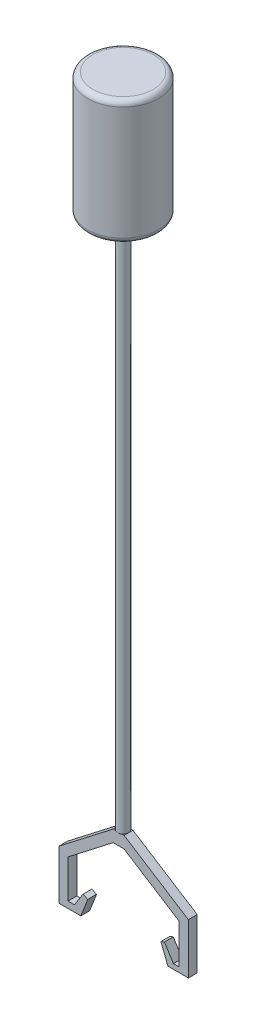
ISO-10303-21;
HEADER;
FILE_DESCRIPTION(('STEP AP214'),'2;1');
FILE_NAME('part.step','',(''),(''),'','','');
FILE_SCHEMA(('AUTOMOTIVE_DESIGN { 1 0 10303 214 1 1 1 1 }'));
ENDSEC;
DATA;
#1=APPLICATION_CONTEXT('core data for automotive mechanical design processes');
#2=APPLICATION_PROTOCOL_DEFINITION('international standard','automotive_design',2000,#1);
#3=PRODUCT_CONTEXT('',#1,'mechanical');
#4=PRODUCT('Part','Part','',(#3));
#5=PRODUCT_RELATED_PRODUCT_CATEGORY('part','',(#4));
#6=PRODUCT_DEFINITION_FORMATION('','',#4);
#7=PRODUCT_DEFINITION_CONTEXT('part definition',#1,'design');
#8=PRODUCT_DEFINITION('design','',#6,#7);
#9=PRODUCT_DEFINITION_SHAPE('','',#8);
#10=(LENGTH_UNIT() NAMED_UNIT(*) SI_UNIT(.MILLI.,.METRE.));
#11=(NAMED_UNIT(*) PLANE_ANGLE_UNIT() SI_UNIT($,.RADIAN.));
#12=(NAMED_UNIT(*) SI_UNIT($,.STERADIAN.) SOLID_ANGLE_UNIT());
#13=UNCERTAINTY_MEASURE_WITH_UNIT(LENGTH_MEASURE(1.E-05),#10,'distance_accuracy_value','');
#14=(GEOMETRIC_REPRESENTATION_CONTEXT(3) GLOBAL_UNCERTAINTY_ASSIGNED_CONTEXT((#13)) GLOBAL_UNIT_ASSIGNED_CONTEXT((#10,
#11,#12)) REPRESENTATION_CONTEXT('',''));
#15=CARTESIAN_POINT('',(0.,0.,0.));
#16=DIRECTION('',(0.,0.,1.));
#17=DIRECTION('',(1.,0.,0.));
#18=AXIS2_PLACEMENT_3D('',#15,#16,#17);
#19=CARTESIAN_POINT('',(0.,-1500.,0.));
#20=DIRECTION('',(0.,-1.,0.));
#21=DIRECTION('',(0.,0.,-1.));
#22=AXIS2_PLACEMENT_3D('',#19,#20,#21);
#23=PLANE('',#22);
#24=CARTESIAN_POINT('',(0.,-1500.,0.));
#25=DIRECTION('',(0.,-1.,0.));
#26=DIRECTION('',(0.,0.,-1.));
#27=AXIS2_PLACEMENT_3D('',#24,#25,#26);
#28=CIRCLE('',#27,15.3746627025601);
#29=CARTESIAN_POINT('',(-8.95155032480375,-1500.,-12.5));
#30=VERTEX_POINT('',#29);
#31=CARTESIAN_POINT('',(8.95155032480375,-1500.,-12.5));
#32=VERTEX_POINT('',#31);
#33=EDGE_CURVE('E214',#30,#32,#28,.T.);
#34=ORIENTED_EDGE('',*,*,#33,.T.);
#35=DIRECTION('',(-1.,0.,0.));
#36=VECTOR('',#35,1.);
#37=CARTESIAN_POINT('',(15.3746627025601,-1500.,-12.5));
#38=LINE('',#37,#36);
#39=EDGE_CURVE('E11',#32,#30,#38,.T.);
#40=ORIENTED_EDGE('',*,*,#39,.T.);
#41=EDGE_LOOP('',(#34,#40));
#42=FACE_BOUND('',#41,.T.);
#43=ADVANCED_FACE('F33',(#42),#23,.T.);
#44=CARTESIAN_POINT('',(0.,350.,0.));
#45=DIRECTION('',(0.,-1.,0.));
#46=DIRECTION('',(0.,0.,-1.));
#47=AXIS2_PLACEMENT_3D('',#44,#45,#46);
#48=CYLINDRICAL_SURFACE('',#47,100.);
#49=CARTESIAN_POINT('',(0.,15.,0.));
#50=DIRECTION('',(0.,1.,0.));
#51=DIRECTION('',(0.,0.,1.));
#52=AXIS2_PLACEMENT_3D('',#49,#50,#51);
#53=CIRCLE('',#52,100.);
#54=CARTESIAN_POINT('',(0.,15.,100.));
#55=VERTEX_POINT('',#54);
#56=EDGE_CURVE('E227',#55,#55,#53,.T.);
#57=ORIENTED_EDGE('',*,*,#56,.T.);
#58=EDGE_LOOP('',(#57));
#59=FACE_BOUND('',#58,.T.);
#60=CARTESIAN_POINT('',(0.,335.,0.));
#61=DIRECTION('',(0.,1.,0.));
#62=DIRECTION('',(0.,0.,1.));
#63=AXIS2_PLACEMENT_3D('',#60,#61,#62);
#64=CIRCLE('',#63,100.);
#65=CARTESIAN_POINT('',(0.,335.,100.));
#66=VERTEX_POINT('',#65);
#67=EDGE_CURVE('E223',#66,#66,#64,.F.);
#68=ORIENTED_EDGE('',*,*,#67,.T.);
#69=EDGE_LOOP('',(#68));
#70=FACE_BOUND('',#69,.T.);
#71=ADVANCED_FACE('F484',(#59,#70),#48,.T.);
#72=CARTESIAN_POINT('',(0.,350.,0.));
#73=DIRECTION('',(0.,1.,0.));
#74=DIRECTION('',(0.,0.,1.));
#75=AXIS2_PLACEMENT_3D('',#72,#73,#74);
#76=PLANE('',#75);
#77=CARTESIAN_POINT('',(0.,350.,0.));
#78=DIRECTION('',(0.,1.,0.));
#79=DIRECTION('',(0.,0.,1.));
#80=AXIS2_PLACEMENT_3D('',#77,#78,#79);
#81=CIRCLE('',#80,85.);
#82=CARTESIAN_POINT('',(0.,350.,85.));
#83=VERTEX_POINT('',#82);
#84=EDGE_CURVE('E232',#83,#83,#81,.T.);
#85=ORIENTED_EDGE('',*,*,#84,.T.);
#86=EDGE_LOOP('',(#85));
#87=FACE_BOUND('',#86,.T.);
#88=ADVANCED_FACE('F490',(#87),#76,.T.);
#89=CARTESIAN_POINT('',(0.,0.,0.));
#90=DIRECTION('',(0.,1.,0.));
#91=DIRECTION('',(0.,0.,1.));
#92=AXIS2_PLACEMENT_3D('',#89,#90,#91);
#93=PLANE('',#92);
#94=CARTESIAN_POINT('',(0.,0.,0.));
#95=DIRECTION('',(0.,1.,0.));
#96=DIRECTION('',(0.,0.,1.));
#97=AXIS2_PLACEMENT_3D('',#94,#95,#96);
#98=CIRCLE('',#97,15.3746627025601);
#99=CARTESIAN_POINT('',(0.,0.,15.3746627025601));
#100=VERTEX_POINT('',#99);
#101=EDGE_CURVE('E37',#100,#100,#98,.F.);
#102=ORIENTED_EDGE('',*,*,#101,.F.);
#103=EDGE_LOOP('',(#102));
#104=FACE_BOUND('',#103,.T.);
#105=CARTESIAN_POINT('',(0.,0.,0.));
#106=DIRECTION('',(0.,1.,0.));
#107=DIRECTION('',(0.,0.,1.));
#108=AXIS2_PLACEMENT_3D('',#105,#106,#107);
#109=CIRCLE('',#108,85.);
#110=CARTESIAN_POINT('',(0.,0.,85.));
#111=VERTEX_POINT('',#110);
#112=EDGE_CURVE('E230',#111,#111,#109,.F.);
#113=ORIENTED_EDGE('',*,*,#112,.T.);
#114=EDGE_LOOP('',(#113));
#115=FACE_BOUND('',#114,.T.);
#116=ADVANCED_FACE('F509',(#104,#115),#93,.F.);
#117=CARTESIAN_POINT('',(0.,15.,0.));
#118=DIRECTION('',(0.,1.,0.));
#119=DIRECTION('',(0.,0.,1.));
#120=AXIS2_PLACEMENT_3D('',#117,#118,#119);
#121=TOROIDAL_SURFACE('',#120,85.,15.);
#122=ORIENTED_EDGE('',*,*,#112,.F.);
#123=EDGE_LOOP('',(#122));
#124=FACE_BOUND('',#123,.T.);
#125=ORIENTED_EDGE('',*,*,#56,.F.);
#126=EDGE_LOOP('',(#125));
#127=FACE_BOUND('',#126,.T.);
#128=ADVANCED_FACE('F504',(#124,#127),#121,.T.);
#129=CARTESIAN_POINT('',(0.,335.,0.));
#130=DIRECTION('',(0.,1.,0.));
#131=DIRECTION('',(0.,0.,1.));
#132=AXIS2_PLACEMENT_3D('',#129,#130,#131);
#133=TOROIDAL_SURFACE('',#132,85.,15.);
#134=ORIENTED_EDGE('',*,*,#67,.F.);
#135=EDGE_LOOP('',(#134));
#136=FACE_BOUND('',#135,.T.);
#137=ORIENTED_EDGE('',*,*,#84,.F.);
#138=EDGE_LOOP('',(#137));
#139=FACE_BOUND('',#138,.T.);
#140=ADVANCED_FACE('F35',(#136,#139),#133,.T.);
#141=CARTESIAN_POINT('',(0.,-1500.,0.));
#142=DIRECTION('',(0.,1.,0.));
#143=DIRECTION('',(0.,0.,1.));
#144=AXIS2_PLACEMENT_3D('',#141,#142,#143);
#145=CYLINDRICAL_SURFACE('',#144,15.3746627025601);
#146=CARTESIAN_POINT('',(15.3746627025601,-1500.,0.));
#147=VERTEX_POINT('',#146);
#148=EDGE_CURVE('E218',#32,#147,#28,.T.);
#149=ORIENTED_EDGE('',*,*,#148,.F.);
#150=ORIENTED_EDGE('',*,*,#33,.F.);
#151=CARTESIAN_POINT('',(-15.3746627025601,-1500.,0.));
#152=VERTEX_POINT('',#151);
#153=EDGE_CURVE('E56',#152,#30,#28,.T.);
#154=ORIENTED_EDGE('',*,*,#153,.F.);
#155=CARTESIAN_POINT('',(-8.95155032480375,-1500.,12.5));
#156=VERTEX_POINT('',#155);
#157=EDGE_CURVE('E212',#156,#152,#28,.T.);
#158=ORIENTED_EDGE('',*,*,#157,.F.);
#159=CARTESIAN_POINT('',(8.95155032480375,-1500.,12.5));
#160=VERTEX_POINT('',#159);
#161=EDGE_CURVE('E250',#160,#156,#28,.T.);
#162=ORIENTED_EDGE('',*,*,#161,.F.);
#163=EDGE_CURVE('E224',#147,#160,#28,.T.);
#164=ORIENTED_EDGE('',*,*,#163,.F.);
#165=EDGE_LOOP('',(#149,#150,#154,#158,#162,#164));
#166=FACE_BOUND('',#165,.T.);
#167=ORIENTED_EDGE('',*,*,#101,.T.);
#168=EDGE_LOOP('',(#167));
#169=FACE_BOUND('',#168,.T.);
#170=ADVANCED_FACE('F496',(#166,#169),#145,.T.);
#171=DIRECTION('',(-1.,0.,0.));
#172=VECTOR('',#171,1.);
#173=CARTESIAN_POINT('',(15.3746627025601,-1500.,12.5));
#174=LINE('',#173,#172);
#175=EDGE_CURVE('E42',#160,#156,#174,.T.);
#176=ORIENTED_EDGE('',*,*,#175,.F.);
#177=ORIENTED_EDGE('',*,*,#161,.T.);
#178=EDGE_LOOP('',(#176,#177));
#179=FACE_BOUND('',#178,.T.);
#180=ADVANCED_FACE('F486',(#179),#23,.T.);
#181=CARTESIAN_POINT('',(15.3746627025601,-1500.,12.5));
#182=DIRECTION('',(0.,-1.,0.));
#183=DIRECTION('',(0.,0.,-1.));
#184=AXIS2_PLACEMENT_3D('',#181,#182,#183);
#185=PLANE('',#184);
#186=CARTESIAN_POINT('',(15.3746627025601,-1500.,-12.5));
#187=VERTEX_POINT('',#186);
#188=EDGE_CURVE('E44',#187,#32,#38,.T.);
#189=ORIENTED_EDGE('',*,*,#188,.T.);
#190=ORIENTED_EDGE('',*,*,#148,.T.);
#191=DIRECTION('',(0.,0.,-1.));
#192=VECTOR('',#191,1.);
#193=CARTESIAN_POINT('',(15.3746627025601,-1500.,12.5));
#194=LINE('',#193,#192);
#195=EDGE_CURVE('E308',#147,#187,#194,.T.);
#196=ORIENTED_EDGE('',*,*,#195,.T.);
#197=EDGE_LOOP('',(#189,#190,#196));
#198=FACE_BOUND('',#197,.T.);
#199=ADVANCED_FACE('F407',(#198),#185,.F.);
#200=CARTESIAN_POINT('',(15.3746627025601,-1500.,12.5));
#201=VERTEX_POINT('',#200);
#202=EDGE_CURVE('E247',#201,#147,#194,.T.);
#203=ORIENTED_EDGE('',*,*,#202,.T.);
#204=ORIENTED_EDGE('',*,*,#163,.T.);
#205=EDGE_CURVE('E199',#201,#160,#174,.T.);
#206=ORIENTED_EDGE('',*,*,#205,.F.);
#207=EDGE_LOOP('',(#203,#204,#206));
#208=FACE_BOUND('',#207,.T.);
#209=ADVANCED_FACE('F246',(#208),#185,.F.);
#210=CARTESIAN_POINT('',(-15.3746627025601,-1500.,12.5));
#211=VERTEX_POINT('',#210);
#212=EDGE_CURVE('E191',#156,#211,#174,.T.);
#213=ORIENTED_EDGE('',*,*,#212,.F.);
#214=ORIENTED_EDGE('',*,*,#157,.T.);
#215=DIRECTION('',(0.,0.,-1.));
#216=VECTOR('',#215,1.);
#217=CARTESIAN_POINT('',(-15.3746627025601,-1500.,12.5));
#218=LINE('',#217,#216);
#219=EDGE_CURVE('E205',#211,#152,#218,.T.);
#220=ORIENTED_EDGE('',*,*,#219,.F.);
#221=EDGE_LOOP('',(#213,#214,#220));
#222=FACE_BOUND('',#221,.T.);
#223=ADVANCED_FACE('F211',(#222),#185,.F.);
#224=CARTESIAN_POINT('',(-15.3746627025601,-1500.,-12.5));
#225=VERTEX_POINT('',#224);
#226=EDGE_CURVE('E215',#152,#225,#218,.T.);
#227=ORIENTED_EDGE('',*,*,#226,.F.);
#228=ORIENTED_EDGE('',*,*,#153,.T.);
#229=EDGE_CURVE('E45',#30,#225,#38,.T.);
#230=ORIENTED_EDGE('',*,*,#229,.T.);
#231=EDGE_LOOP('',(#227,#228,#230));
#232=FACE_BOUND('',#231,.T.);
#233=ADVANCED_FACE('F255',(#232),#185,.F.);
#234=CARTESIAN_POINT('',(-158.626316743505,-1610.66665151953,12.5));
#235=DIRECTION('',(0.611351309580811,-0.7913593218468,0.));
#236=DIRECTION('',(0.7913593218468,0.611351309580811,0.));
#237=AXIS2_PLACEMENT_3D('',#234,#235,#236);
#238=PLANE('',#237);
#239=DIRECTION('',(-0.7913593218468,-0.611351309580811,0.));
#240=VECTOR('',#239,1.);
#241=CARTESIAN_POINT('',(-158.626316743505,-1610.66665151953,-12.5));
#242=LINE('',#241,#240);
#243=CARTESIAN_POINT('',(-168.799765014435,-1618.52597755725,-12.5));
#244=VERTEX_POINT('',#243);
#245=EDGE_CURVE('E262',#225,#244,#242,.T.);
#246=ORIENTED_EDGE('',*,*,#245,.T.);
#247=DIRECTION('',(0.,0.,-1.));
#248=VECTOR('',#247,1.);
#249=CARTESIAN_POINT('',(-168.799765014435,-1618.52597755725,12.5));
#250=LINE('',#249,#248);
#251=CARTESIAN_POINT('',(-168.799765014435,-1618.52597755725,12.5));
#252=VERTEX_POINT('',#251);
#253=EDGE_CURVE('E207',#252,#244,#250,.T.);
#254=ORIENTED_EDGE('',*,*,#253,.F.);
#255=DIRECTION('',(-0.7913593218468,-0.611351309580811,0.));
#256=VECTOR('',#255,1.);
#257=CARTESIAN_POINT('',(-15.3746627025601,-1500.,12.5));
#258=LINE('',#257,#256);
#259=EDGE_CURVE('E195',#211,#252,#258,.T.);
#260=ORIENTED_EDGE('',*,*,#259,.F.);
#261=ORIENTED_EDGE('',*,*,#219,.T.);
#262=ORIENTED_EDGE('',*,*,#226,.T.);
#263=EDGE_LOOP('',(#246,#254,#260,#261,#262));
#264=FACE_BOUND('',#263,.T.);
#265=ADVANCED_FACE('F204',(#264),#238,.F.);
#266=CARTESIAN_POINT('',(-168.799765014435,-1618.52597755725,12.5));
#267=DIRECTION('',(1.,0.,0.));
#268=DIRECTION('',(0.,1.,0.));
#269=AXIS2_PLACEMENT_3D('',#266,#267,#268);
#270=PLANE('',#269);
#271=DIRECTION('',(0.,-1.,0.));
#272=VECTOR('',#271,1.);
#273=CARTESIAN_POINT('',(-168.799765014435,-1618.52597755725,-12.5));
#274=LINE('',#273,#272);
#275=CARTESIAN_POINT('',(-168.799765014435,-1757.60890789188,-12.5));
#276=VERTEX_POINT('',#275);
#277=EDGE_CURVE('E267',#244,#276,#274,.T.);
#278=ORIENTED_EDGE('',*,*,#277,.T.);
#279=DIRECTION('',(0.,0.,-1.));
#280=VECTOR('',#279,1.);
#281=CARTESIAN_POINT('',(-168.799765014435,-1757.60890789188,12.5));
#282=LINE('',#281,#280);
#283=CARTESIAN_POINT('',(-168.799765014435,-1757.60890789188,12.5));
#284=VERTEX_POINT('',#283);
#285=EDGE_CURVE('E355',#284,#276,#282,.T.);
#286=ORIENTED_EDGE('',*,*,#285,.F.);
#287=DIRECTION('',(0.,-1.,0.));
#288=VECTOR('',#287,1.);
#289=CARTESIAN_POINT('',(-168.799765014435,-1618.52597755725,12.5));
#290=LINE('',#289,#288);
#291=EDGE_CURVE('E209',#252,#284,#290,.T.);
#292=ORIENTED_EDGE('',*,*,#291,.F.);
#293=ORIENTED_EDGE('',*,*,#253,.T.);
#294=EDGE_LOOP('',(#278,#286,#292,#293));
#295=FACE_BOUND('',#294,.T.);
#296=ADVANCED_FACE('F361',(#295),#270,.F.);
#297=CARTESIAN_POINT('',(-142.539373210404,-1757.60890789188,12.5));
#298=DIRECTION('',(0.,1.,0.));
#299=DIRECTION('',(0.,0.,1.));
#300=AXIS2_PLACEMENT_3D('',#297,#298,#299);
#301=PLANE('',#300);
#302=DIRECTION('',(1.,0.,0.));
#303=VECTOR('',#302,1.);
#304=CARTESIAN_POINT('',(-142.539373210404,-1757.60890789188,-12.5));
#305=LINE('',#304,#303);
#306=CARTESIAN_POINT('',(-106.609537560218,-1757.60890789188,-12.5));
#307=VERTEX_POINT('',#306);
#308=EDGE_CURVE('E270',#276,#307,#305,.T.);
#309=ORIENTED_EDGE('',*,*,#308,.T.);
#310=DIRECTION('',(0.,0.,-1.));
#311=VECTOR('',#310,1.);
#312=CARTESIAN_POINT('',(-106.609537560218,-1757.60890789188,12.5));
#313=LINE('',#312,#311);
#314=CARTESIAN_POINT('',(-106.609537560218,-1757.60890789188,12.5));
#315=VERTEX_POINT('',#314);
#316=EDGE_CURVE('E353',#315,#307,#313,.T.);
#317=ORIENTED_EDGE('',*,*,#316,.F.);
#318=DIRECTION('',(1.,0.,0.));
#319=VECTOR('',#318,1.);
#320=CARTESIAN_POINT('',(-168.799765014435,-1757.60890789188,12.5));
#321=LINE('',#320,#319);
#322=EDGE_CURVE('E373',#284,#315,#321,.T.);
#323=ORIENTED_EDGE('',*,*,#322,.F.);
#324=ORIENTED_EDGE('',*,*,#285,.T.);
#325=EDGE_LOOP('',(#309,#317,#323,#324));
#326=FACE_BOUND('',#325,.T.);
#327=ADVANCED_FACE('F365',(#326),#301,.F.);
#328=CARTESIAN_POINT('',(-106.609537560218,-1757.60890789188,12.5));
#329=DIRECTION('',(-0.9316577784868,0.363337011306363,0.));
#330=DIRECTION('',(-0.363337011306363,-0.9316577784868,0.));
#331=AXIS2_PLACEMENT_3D('',#328,#329,#330);
#332=PLANE('',#331);
#333=DIRECTION('',(0.363337011306363,0.9316577784868,0.));
#334=VECTOR('',#333,1.);
#335=CARTESIAN_POINT('',(-106.609537560218,-1757.60890789188,-12.5));
#336=LINE('',#335,#334);
#337=CARTESIAN_POINT('',(-87.0004897230324,-1707.32798032948,-12.5));
#338=VERTEX_POINT('',#337);
#339=EDGE_CURVE('E272',#307,#338,#336,.T.);
#340=ORIENTED_EDGE('',*,*,#339,.T.);
#341=DIRECTION('',(0.,0.,-1.));
#342=VECTOR('',#341,1.);
#343=CARTESIAN_POINT('',(-87.0004897230324,-1707.32798032948,12.5));
#344=LINE('',#343,#342);
#345=CARTESIAN_POINT('',(-87.0004897230324,-1707.32798032948,12.5));
#346=VERTEX_POINT('',#345);
#347=EDGE_CURVE('E350',#346,#338,#344,.T.);
#348=ORIENTED_EDGE('',*,*,#347,.F.);
#349=DIRECTION('',(0.363337011306363,0.9316577784868,0.));
#350=VECTOR('',#349,1.);
#351=CARTESIAN_POINT('',(-106.609537560218,-1757.60890789188,12.5));
#352=LINE('',#351,#350);
#353=EDGE_CURVE('E370',#315,#346,#352,.T.);
#354=ORIENTED_EDGE('',*,*,#353,.F.);
#355=ORIENTED_EDGE('',*,*,#316,.T.);
#356=EDGE_LOOP('',(#340,#348,#354,#355));
#357=FACE_BOUND('',#356,.T.);
#358=ADVANCED_FACE('F368',(#357),#332,.F.);
#359=CARTESIAN_POINT('',(-87.0004897230324,-1707.32798032948,12.5));
#360=DIRECTION('',(-0.363337011306362,-0.931657778486801,0.));
#361=DIRECTION('',(0.931657778486801,-0.363337011306362,0.));
#362=AXIS2_PLACEMENT_3D('',#359,#360,#361);
#363=PLANE('',#362);
#364=DIRECTION('',(-0.931657778486801,0.363337011306361,0.));
#365=VECTOR('',#364,1.);
#366=CARTESIAN_POINT('',(-87.0004897230324,-1707.32798032948,-12.5));
#367=LINE('',#366,#365);
#368=CARTESIAN_POINT('',(-100.774753953756,-1701.95615806373,-12.5));
#369=VERTEX_POINT('',#368);
#370=EDGE_CURVE('E274',#338,#369,#367,.T.);
#371=ORIENTED_EDGE('',*,*,#370,.T.);
#372=DIRECTION('',(0.,0.,-1.));
#373=VECTOR('',#372,1.);
#374=CARTESIAN_POINT('',(-100.774753953756,-1701.95615806373,12.5));
#375=LINE('',#374,#373);
#376=CARTESIAN_POINT('',(-100.774753953756,-1701.95615806373,12.5));
#377=VERTEX_POINT('',#376);
#378=EDGE_CURVE('E347',#377,#369,#375,.T.);
#379=ORIENTED_EDGE('',*,*,#378,.F.);
#380=DIRECTION('',(-0.931657778486801,0.363337011306361,0.));
#381=VECTOR('',#380,1.);
#382=CARTESIAN_POINT('',(-87.0004897230324,-1707.32798032948,12.5));
#383=LINE('',#382,#381);
#384=EDGE_CURVE('E372',#346,#377,#383,.T.);
#385=ORIENTED_EDGE('',*,*,#384,.F.);
#386=ORIENTED_EDGE('',*,*,#347,.T.);
#387=EDGE_LOOP('',(#371,#379,#385,#386));
#388=FACE_BOUND('',#387,.T.);
#389=ADVANCED_FACE('F472',(#388),#363,.F.);
#390=CARTESIAN_POINT('',(-120.173982412122,-1732.46844411068,12.5));
#391=DIRECTION('',(0.843882904978558,-0.536527392296936,0.));
#392=DIRECTION('',(0.536527392296936,0.843882904978558,0.));
#393=AXIS2_PLACEMENT_3D('',#390,#391,#392);
#394=PLANE('',#393);
#395=DIRECTION('',(-0.536527392296936,-0.843882904978558,0.));
#396=VECTOR('',#395,1.);
#397=CARTESIAN_POINT('',(-120.173982412122,-1732.46844411068,-12.5));
#398=LINE('',#397,#396);
#399=CARTESIAN_POINT('',(-124.574455385311,-1739.38977556404,-12.5));
#400=VERTEX_POINT('',#399);
#401=EDGE_CURVE('E277',#369,#400,#398,.T.);
#402=ORIENTED_EDGE('',*,*,#401,.T.);
#403=DIRECTION('',(0.,0.,-1.));
#404=VECTOR('',#403,1.);
#405=CARTESIAN_POINT('',(-124.574455385311,-1739.38977556404,12.5));
#406=LINE('',#405,#404);
#407=CARTESIAN_POINT('',(-124.574455385311,-1739.38977556404,12.5));
#408=VERTEX_POINT('',#407);
#409=EDGE_CURVE('E344',#408,#400,#406,.T.);
#410=ORIENTED_EDGE('',*,*,#409,.F.);
#411=DIRECTION('',(-0.536527392296936,-0.843882904978558,0.));
#412=VECTOR('',#411,1.);
#413=CARTESIAN_POINT('',(-100.774753953756,-1701.95615806373,12.5));
#414=LINE('',#413,#412);
#415=EDGE_CURVE('E375',#377,#408,#414,.T.);
#416=ORIENTED_EDGE('',*,*,#415,.F.);
#417=ORIENTED_EDGE('',*,*,#378,.T.);
#418=EDGE_LOOP('',(#402,#410,#416,#417));
#419=FACE_BOUND('',#418,.T.);
#420=ADVANCED_FACE('F474',(#419),#394,.F.);
#421=CARTESIAN_POINT('',(-124.574455385311,-1739.38977556404,12.5));
#422=DIRECTION('',(0.,-1.,0.));
#423=DIRECTION('',(0.,0.,-1.));
#424=AXIS2_PLACEMENT_3D('',#421,#422,#423);
#425=PLANE('',#424);
#426=DIRECTION('',(-1.,0.,0.));
#427=VECTOR('',#426,1.);
#428=CARTESIAN_POINT('',(-124.574455385311,-1739.38977556404,-12.5));
#429=LINE('',#428,#427);
#430=CARTESIAN_POINT('',(-142.539373210404,-1739.38977556404,-12.5));
#431=VERTEX_POINT('',#430);
#432=EDGE_CURVE('E279',#400,#431,#429,.T.);
#433=ORIENTED_EDGE('',*,*,#432,.T.);
#434=DIRECTION('',(0.,0.,-1.));
#435=VECTOR('',#434,1.);
#436=CARTESIAN_POINT('',(-142.539373210404,-1739.38977556404,12.5));
#437=LINE('',#436,#435);
#438=CARTESIAN_POINT('',(-142.539373210404,-1739.38977556404,12.5));
#439=VERTEX_POINT('',#438);
#440=EDGE_CURVE('E341',#439,#431,#437,.T.);
#441=ORIENTED_EDGE('',*,*,#440,.F.);
#442=DIRECTION('',(-1.,0.,0.));
#443=VECTOR('',#442,1.);
#444=CARTESIAN_POINT('',(-124.574455385311,-1739.38977556404,12.5));
#445=LINE('',#444,#443);
#446=EDGE_CURVE('E381',#408,#439,#445,.T.);
#447=ORIENTED_EDGE('',*,*,#446,.F.);
#448=ORIENTED_EDGE('',*,*,#409,.T.);
#449=EDGE_LOOP('',(#433,#441,#447,#448));
#450=FACE_BOUND('',#449,.T.);
#451=ADVANCED_FACE('F467',(#450),#425,.F.);
#452=CARTESIAN_POINT('',(-142.539373210404,-1631.49028029963,12.5));
#453=DIRECTION('',(-1.,0.,0.));
#454=DIRECTION('',(0.,0.,1.));
#455=AXIS2_PLACEMENT_3D('',#452,#453,#454);
#456=PLANE('',#455);
#457=DIRECTION('',(0.,1.,0.));
#458=VECTOR('',#457,1.);
#459=CARTESIAN_POINT('',(-142.539373210404,-1631.49028029963,-12.5));
#460=LINE('',#459,#458);
#461=CARTESIAN_POINT('',(-142.539373210404,-1631.49028029963,-12.5));
#462=VERTEX_POINT('',#461);
#463=EDGE_CURVE('E281',#431,#462,#460,.T.);
#464=ORIENTED_EDGE('',*,*,#463,.T.);
#465=DIRECTION('',(0.,0.,-1.));
#466=VECTOR('',#465,1.);
#467=CARTESIAN_POINT('',(-142.539373210404,-1631.49028029963,12.5));
#468=LINE('',#467,#466);
#469=CARTESIAN_POINT('',(-142.539373210404,-1631.49028029963,12.5));
#470=VERTEX_POINT('',#469);
#471=EDGE_CURVE('E338',#470,#462,#468,.T.);
#472=ORIENTED_EDGE('',*,*,#471,.F.);
#473=DIRECTION('',(0.,1.,0.));
#474=VECTOR('',#473,1.);
#475=CARTESIAN_POINT('',(-142.539373210404,-1631.49028029963,12.5));
#476=LINE('',#475,#474);
#477=EDGE_CURVE('E383',#439,#470,#476,.T.);
#478=ORIENTED_EDGE('',*,*,#477,.F.);
#479=ORIENTED_EDGE('',*,*,#440,.T.);
#480=EDGE_LOOP('',(#464,#472,#478,#479));
#481=FACE_BOUND('',#480,.T.);
#482=ADVANCED_FACE('F463',(#481),#456,.F.);
#483=CARTESIAN_POINT('',(-15.3746627025601,-1533.25132593942,12.5));
#484=DIRECTION('',(-0.611351309580811,0.7913593218468,0.));
#485=DIRECTION('',(-0.7913593218468,-0.611351309580811,0.));
#486=AXIS2_PLACEMENT_3D('',#483,#484,#485);
#487=PLANE('',#486);
#488=DIRECTION('',(0.7913593218468,0.611351309580811,0.));
#489=VECTOR('',#488,1.);
#490=CARTESIAN_POINT('',(-15.3746627025601,-1533.25132593942,-12.5));
#491=LINE('',#490,#489);
#492=CARTESIAN_POINT('',(-15.3746627025601,-1533.25132593942,-12.5));
#493=VERTEX_POINT('',#492);
#494=EDGE_CURVE('E283',#462,#493,#491,.T.);
#495=ORIENTED_EDGE('',*,*,#494,.T.);
#496=DIRECTION('',(0.,0.,-1.));
#497=VECTOR('',#496,1.);
#498=CARTESIAN_POINT('',(-15.3746627025601,-1533.25132593942,12.5));
#499=LINE('',#498,#497);
#500=CARTESIAN_POINT('',(-15.3746627025601,-1533.25132593942,12.5));
#501=VERTEX_POINT('',#500);
#502=EDGE_CURVE('E335',#501,#493,#499,.T.);
#503=ORIENTED_EDGE('',*,*,#502,.F.);
#504=DIRECTION('',(0.7913593218468,0.611351309580811,0.));
#505=VECTOR('',#504,1.);
#506=CARTESIAN_POINT('',(-15.3746627025601,-1533.25132593942,12.5));
#507=LINE('',#506,#505);
#508=EDGE_CURVE('E385',#470,#501,#507,.T.);
#509=ORIENTED_EDGE('',*,*,#508,.F.);
#510=ORIENTED_EDGE('',*,*,#471,.T.);
#511=EDGE_LOOP('',(#495,#503,#509,#510));
#512=FACE_BOUND('',#511,.T.);
#513=ADVANCED_FACE('F458',(#512),#487,.F.);
#514=CARTESIAN_POINT('',(15.3746627025602,-1533.25132593942,12.5));
#515=DIRECTION('',(0.,1.,0.));
#516=DIRECTION('',(0.,0.,1.));
#517=AXIS2_PLACEMENT_3D('',#514,#515,#516);
#518=PLANE('',#517);
#519=DIRECTION('',(1.,0.,0.));
#520=VECTOR('',#519,1.);
#521=CARTESIAN_POINT('',(15.3746627025602,-1533.25132593942,-12.5));
#522=LINE('',#521,#520);
#523=CARTESIAN_POINT('',(15.3746627025602,-1533.25132593942,-12.5));
#524=VERTEX_POINT('',#523);
#525=EDGE_CURVE('E285',#493,#524,#522,.T.);
#526=ORIENTED_EDGE('',*,*,#525,.T.);
#527=DIRECTION('',(0.,0.,-1.));
#528=VECTOR('',#527,1.);
#529=CARTESIAN_POINT('',(15.3746627025602,-1533.25132593942,12.5));
#530=LINE('',#529,#528);
#531=CARTESIAN_POINT('',(15.3746627025602,-1533.25132593942,12.5));
#532=VERTEX_POINT('',#531);
#533=EDGE_CURVE('E332',#532,#524,#530,.T.);
#534=ORIENTED_EDGE('',*,*,#533,.F.);
#535=DIRECTION('',(1.,0.,0.));
#536=VECTOR('',#535,1.);
#537=CARTESIAN_POINT('',(15.3746627025602,-1533.25132593942,12.5));
#538=LINE('',#537,#536);
#539=EDGE_CURVE('E387',#501,#532,#538,.T.);
#540=ORIENTED_EDGE('',*,*,#539,.F.);
#541=ORIENTED_EDGE('',*,*,#502,.T.);
#542=EDGE_LOOP('',(#526,#534,#540,#541));
#543=FACE_BOUND('',#542,.T.);
#544=ADVANCED_FACE('F452',(#543),#518,.F.);
#545=CARTESIAN_POINT('',(169.89086332493,-1631.49028029963,12.5));
#546=DIRECTION('',(0.536527392296936,0.843882904978558,0.));
#547=DIRECTION('',(-0.843882904978558,0.536527392296936,0.));
#548=AXIS2_PLACEMENT_3D('',#545,#546,#547);
#549=PLANE('',#548);
#550=DIRECTION('',(0.843882904978558,-0.536527392296936,0.));
#551=VECTOR('',#550,1.);
#552=CARTESIAN_POINT('',(169.89086332493,-1631.49028029963,-12.5));
#553=LINE('',#552,#551);
#554=CARTESIAN_POINT('',(169.89086332493,-1631.49028029963,-12.5));
#555=VERTEX_POINT('',#554);
#556=EDGE_CURVE('E287',#524,#555,#553,.T.);
#557=ORIENTED_EDGE('',*,*,#556,.T.);
#558=DIRECTION('',(0.,0.,-1.));
#559=VECTOR('',#558,1.);
#560=CARTESIAN_POINT('',(169.89086332493,-1631.49028029963,12.5));
#561=LINE('',#560,#559);
#562=CARTESIAN_POINT('',(169.89086332493,-1631.49028029963,12.5));
#563=VERTEX_POINT('',#562);
#564=EDGE_CURVE('E329',#563,#555,#561,.T.);
#565=ORIENTED_EDGE('',*,*,#564,.F.);
#566=DIRECTION('',(0.843882904978558,-0.536527392296936,0.));
#567=VECTOR('',#566,1.);
#568=CARTESIAN_POINT('',(169.89086332493,-1631.49028029963,12.5));
#569=LINE('',#568,#567);
#570=EDGE_CURVE('E389',#532,#563,#569,.T.);
#571=ORIENTED_EDGE('',*,*,#570,.F.);
#572=ORIENTED_EDGE('',*,*,#533,.T.);
#573=EDGE_LOOP('',(#557,#565,#571,#572));
#574=FACE_BOUND('',#573,.T.);
#575=ADVANCED_FACE('F448',(#574),#549,.F.);
#576=CARTESIAN_POINT('',(169.89086332493,-1743.65731220869,12.5));
#577=DIRECTION('',(1.,0.,0.));
#578=DIRECTION('',(0.,0.,-1.));
#579=AXIS2_PLACEMENT_3D('',#576,#577,#578);
#580=PLANE('',#579);
#581=DIRECTION('',(0.,-1.,0.));
#582=VECTOR('',#581,1.);
#583=CARTESIAN_POINT('',(169.89086332493,-1743.65731220869,-12.5));
#584=LINE('',#583,#582);
#585=CARTESIAN_POINT('',(169.89086332493,-1743.65731220869,-12.5));
#586=VERTEX_POINT('',#585);
#587=EDGE_CURVE('E289',#555,#586,#584,.T.);
#588=ORIENTED_EDGE('',*,*,#587,.T.);
#589=DIRECTION('',(0.,0.,-1.));
#590=VECTOR('',#589,1.);
#591=CARTESIAN_POINT('',(169.89086332493,-1743.65731220869,12.5));
#592=LINE('',#591,#590);
#593=CARTESIAN_POINT('',(169.89086332493,-1743.65731220869,12.5));
#594=VERTEX_POINT('',#593);
#595=EDGE_CURVE('E326',#594,#586,#592,.T.);
#596=ORIENTED_EDGE('',*,*,#595,.F.);
#597=DIRECTION('',(0.,-1.,0.));
#598=VECTOR('',#597,1.);
#599=CARTESIAN_POINT('',(169.89086332493,-1743.65731220869,12.5));
#600=LINE('',#599,#598);
#601=EDGE_CURVE('E391',#563,#594,#600,.T.);
#602=ORIENTED_EDGE('',*,*,#601,.F.);
#603=ORIENTED_EDGE('',*,*,#564,.T.);
#604=EDGE_LOOP('',(#588,#596,#602,#603));
#605=FACE_BOUND('',#604,.T.);
#606=ADVANCED_FACE('F443',(#605),#580,.F.);
#607=CARTESIAN_POINT('',(154.441928732563,-1743.65731220869,12.5));
#608=DIRECTION('',(0.,-1.,0.));
#609=DIRECTION('',(1.,0.,0.));
#610=AXIS2_PLACEMENT_3D('',#607,#608,#609);
#611=PLANE('',#610);
#612=DIRECTION('',(-1.,0.,0.));
#613=VECTOR('',#612,1.);
#614=CARTESIAN_POINT('',(154.441928732563,-1743.65731220869,-12.5));
#615=LINE('',#614,#613);
#616=CARTESIAN_POINT('',(154.441928732563,-1743.65731220869,-12.5));
#617=VERTEX_POINT('',#616);
#618=EDGE_CURVE('E291',#586,#617,#615,.T.);
#619=ORIENTED_EDGE('',*,*,#618,.T.);
#620=DIRECTION('',(0.,0.,-1.));
#621=VECTOR('',#620,1.);
#622=CARTESIAN_POINT('',(154.441928732563,-1743.65731220869,12.5));
#623=LINE('',#622,#621);
#624=CARTESIAN_POINT('',(154.441928732563,-1743.65731220869,12.5));
#625=VERTEX_POINT('',#624);
#626=EDGE_CURVE('E323',#625,#617,#623,.T.);
#627=ORIENTED_EDGE('',*,*,#626,.F.);
#628=DIRECTION('',(-1.,0.,0.));
#629=VECTOR('',#628,1.);
#630=CARTESIAN_POINT('',(154.441928732563,-1743.65731220869,12.5));
#631=LINE('',#630,#629);
#632=EDGE_CURVE('E393',#594,#625,#631,.T.);
#633=ORIENTED_EDGE('',*,*,#632,.F.);
#634=ORIENTED_EDGE('',*,*,#595,.T.);
#635=EDGE_LOOP('',(#619,#627,#633,#634));
#636=FACE_BOUND('',#635,.T.);
#637=ADVANCED_FACE('F437',(#636),#611,.F.);
#638=CARTESIAN_POINT('',(129.049158785716,-1703.39488416953,12.5));
#639=DIRECTION('',(-0.845831432775651,-0.53345026696843,0.));
#640=DIRECTION('',(0.53345026696843,-0.845831432775651,0.));
#641=AXIS2_PLACEMENT_3D('',#638,#639,#640);
#642=PLANE('',#641);
#643=DIRECTION('',(-0.53345026696843,0.845831432775651,0.));
#644=VECTOR('',#643,1.);
#645=CARTESIAN_POINT('',(129.049158785716,-1703.39488416953,-12.5));
#646=LINE('',#645,#644);
#647=CARTESIAN_POINT('',(129.049158785716,-1703.39488416953,-12.5));
#648=VERTEX_POINT('',#647);
#649=EDGE_CURVE('E293',#617,#648,#646,.T.);
#650=ORIENTED_EDGE('',*,*,#649,.T.);
#651=DIRECTION('',(0.,0.,-1.));
#652=VECTOR('',#651,1.);
#653=CARTESIAN_POINT('',(129.049158785716,-1703.39488416953,12.5));
#654=LINE('',#653,#652);
#655=CARTESIAN_POINT('',(129.049158785716,-1703.39488416953,12.5));
#656=VERTEX_POINT('',#655);
#657=EDGE_CURVE('E320',#656,#648,#654,.T.);
#658=ORIENTED_EDGE('',*,*,#657,.F.);
#659=DIRECTION('',(-0.53345026696843,0.845831432775651,0.));
#660=VECTOR('',#659,1.);
#661=CARTESIAN_POINT('',(129.049158785716,-1703.39488416953,12.5));
#662=LINE('',#661,#660);
#663=EDGE_CURVE('E395',#625,#656,#662,.T.);
#664=ORIENTED_EDGE('',*,*,#663,.F.);
#665=ORIENTED_EDGE('',*,*,#626,.T.);
#666=EDGE_LOOP('',(#650,#658,#664,#665));
#667=FACE_BOUND('',#666,.T.);
#668=ADVANCED_FACE('F433',(#667),#642,.F.);
#669=CARTESIAN_POINT('',(119.105323431235,-1707.32798032948,12.5));
#670=DIRECTION('',(0.367805463382433,-0.929902758951727,0.));
#671=DIRECTION('',(0.929902758951727,0.367805463382433,0.));
#672=AXIS2_PLACEMENT_3D('',#669,#670,#671);
#673=PLANE('',#672);
#674=DIRECTION('',(-0.929902758951727,-0.367805463382433,0.));
#675=VECTOR('',#674,1.);
#676=CARTESIAN_POINT('',(119.105323431235,-1707.32798032948,-12.5));
#677=LINE('',#676,#675);
#678=CARTESIAN_POINT('',(119.105323431235,-1707.32798032948,-12.5));
#679=VERTEX_POINT('',#678);
#680=EDGE_CURVE('E295',#648,#679,#677,.T.);
#681=ORIENTED_EDGE('',*,*,#680,.T.);
#682=DIRECTION('',(0.,0.,-1.));
#683=VECTOR('',#682,1.);
#684=CARTESIAN_POINT('',(119.105323431235,-1707.32798032948,12.5));
#685=LINE('',#684,#683);
#686=CARTESIAN_POINT('',(119.105323431235,-1707.32798032948,12.5));
#687=VERTEX_POINT('',#686);
#688=EDGE_CURVE('E317',#687,#679,#685,.T.);
#689=ORIENTED_EDGE('',*,*,#688,.F.);
#690=DIRECTION('',(-0.929902758951727,-0.367805463382433,0.));
#691=VECTOR('',#690,1.);
#692=CARTESIAN_POINT('',(119.105323431235,-1707.32798032948,12.5));
#693=LINE('',#692,#691);
#694=EDGE_CURVE('E397',#656,#687,#693,.T.);
#695=ORIENTED_EDGE('',*,*,#694,.F.);
#696=ORIENTED_EDGE('',*,*,#657,.T.);
#697=EDGE_LOOP('',(#681,#689,#695,#696));
#698=FACE_BOUND('',#697,.T.);
#699=ADVANCED_FACE('F428',(#698),#673,.F.);
#700=CARTESIAN_POINT('',(138.992994140197,-1757.60890789188,12.5));
#701=DIRECTION('',(0.929902758951727,0.367805463382432,0.));
#702=DIRECTION('',(-0.367805463382432,0.929902758951727,0.));
#703=AXIS2_PLACEMENT_3D('',#700,#701,#702);
#704=PLANE('',#703);
#705=DIRECTION('',(0.367805463382432,-0.929902758951727,0.));
#706=VECTOR('',#705,1.);
#707=CARTESIAN_POINT('',(138.992994140197,-1757.60890789188,-12.5));
#708=LINE('',#707,#706);
#709=CARTESIAN_POINT('',(138.992994140197,-1757.60890789188,-12.5));
#710=VERTEX_POINT('',#709);
#711=EDGE_CURVE('E297',#679,#710,#708,.T.);
#712=ORIENTED_EDGE('',*,*,#711,.T.);
#713=DIRECTION('',(0.,0.,-1.));
#714=VECTOR('',#713,1.);
#715=CARTESIAN_POINT('',(138.992994140197,-1757.60890789188,12.5));
#716=LINE('',#715,#714);
#717=CARTESIAN_POINT('',(138.992994140197,-1757.60890789188,12.5));
#718=VERTEX_POINT('',#717);
#719=EDGE_CURVE('E314',#718,#710,#716,.T.);
#720=ORIENTED_EDGE('',*,*,#719,.F.);
#721=DIRECTION('',(0.367805463382432,-0.929902758951727,0.));
#722=VECTOR('',#721,1.);
#723=CARTESIAN_POINT('',(138.992994140197,-1757.60890789188,12.5));
#724=LINE('',#723,#722);
#725=EDGE_CURVE('E399',#687,#718,#724,.T.);
#726=ORIENTED_EDGE('',*,*,#725,.F.);
#727=ORIENTED_EDGE('',*,*,#688,.T.);
#728=EDGE_LOOP('',(#712,#720,#726,#727));
#729=FACE_BOUND('',#728,.T.);
#730=ADVANCED_FACE('F422',(#729),#704,.F.);
#731=CARTESIAN_POINT('',(196.643299480861,-1757.60890789188,12.5));
#732=DIRECTION('',(0.,1.,0.));
#733=DIRECTION('',(0.,0.,1.));
#734=AXIS2_PLACEMENT_3D('',#731,#732,#733);
#735=PLANE('',#734);
#736=DIRECTION('',(1.,0.,0.));
#737=VECTOR('',#736,1.);
#738=CARTESIAN_POINT('',(196.643299480861,-1757.60890789188,-12.5));
#739=LINE('',#738,#737);
#740=CARTESIAN_POINT('',(196.643299480861,-1757.60890789188,-12.5));
#741=VERTEX_POINT('',#740);
#742=EDGE_CURVE('E300',#710,#741,#739,.T.);
#743=ORIENTED_EDGE('',*,*,#742,.T.);
#744=DIRECTION('',(0.,0.,-1.));
#745=VECTOR('',#744,1.);
#746=CARTESIAN_POINT('',(196.643299480861,-1757.60890789188,12.5));
#747=LINE('',#746,#745);
#748=CARTESIAN_POINT('',(196.643299480861,-1757.60890789188,12.5));
#749=VERTEX_POINT('',#748);
#750=EDGE_CURVE('E311',#749,#741,#747,.T.);
#751=ORIENTED_EDGE('',*,*,#750,.F.);
#752=DIRECTION('',(1.,0.,0.));
#753=VECTOR('',#752,1.);
#754=CARTESIAN_POINT('',(169.89086332493,-1757.60890789188,12.5));
#755=LINE('',#754,#753);
#756=EDGE_CURVE('E401',#718,#749,#755,.T.);
#757=ORIENTED_EDGE('',*,*,#756,.F.);
#758=ORIENTED_EDGE('',*,*,#719,.T.);
#759=EDGE_LOOP('',(#743,#751,#757,#758));
#760=FACE_BOUND('',#759,.T.);
#761=ADVANCED_FACE('F418',(#760),#735,.F.);
#762=CARTESIAN_POINT('',(196.643299480861,-1615.24772977639,12.5));
#763=DIRECTION('',(-1.,0.,0.));
#764=DIRECTION('',(0.,0.,1.));
#765=AXIS2_PLACEMENT_3D('',#762,#763,#764);
#766=PLANE('',#765);
#767=DIRECTION('',(0.,1.,0.));
#768=VECTOR('',#767,1.);
#769=CARTESIAN_POINT('',(196.643299480861,-1615.24772977639,-12.5));
#770=LINE('',#769,#768);
#771=CARTESIAN_POINT('',(196.643299480861,-1615.24772977639,-12.5));
#772=VERTEX_POINT('',#771);
#773=EDGE_CURVE('E302',#741,#772,#770,.T.);
#774=ORIENTED_EDGE('',*,*,#773,.T.);
#775=DIRECTION('',(0.,0.,-1.));
#776=VECTOR('',#775,1.);
#777=CARTESIAN_POINT('',(196.643299480861,-1615.24772977639,12.5));
#778=LINE('',#777,#776);
#779=CARTESIAN_POINT('',(196.643299480861,-1615.24772977639,12.5));
#780=VERTEX_POINT('',#779);
#781=EDGE_CURVE('E307',#780,#772,#778,.T.);
#782=ORIENTED_EDGE('',*,*,#781,.F.);
#783=DIRECTION('',(0.,1.,0.));
#784=VECTOR('',#783,1.);
#785=CARTESIAN_POINT('',(196.643299480861,-1615.24772977639,12.5));
#786=LINE('',#785,#784);
#787=EDGE_CURVE('E402',#749,#780,#786,.T.);
#788=ORIENTED_EDGE('',*,*,#787,.F.);
#789=ORIENTED_EDGE('',*,*,#750,.T.);
#790=EDGE_LOOP('',(#774,#782,#788,#789));
#791=FACE_BOUND('',#790,.T.);
#792=ADVANCED_FACE('F414',(#791),#766,.F.);
#793=CARTESIAN_POINT('',(15.3746627025601,-1500.,12.5));
#794=DIRECTION('',(-0.536527392296936,-0.843882904978558,0.));
#795=DIRECTION('',(0.843882904978558,-0.536527392296936,0.));
#796=AXIS2_PLACEMENT_3D('',#793,#794,#795);
#797=PLANE('',#796);
#798=DIRECTION('',(-0.843882904978558,0.536527392296936,0.));
#799=VECTOR('',#798,1.);
#800=CARTESIAN_POINT('',(15.3746627025601,-1500.,-12.5));
#801=LINE('',#800,#799);
#802=EDGE_CURVE('E200',#772,#187,#801,.T.);
#803=ORIENTED_EDGE('',*,*,#802,.T.);
#804=ORIENTED_EDGE('',*,*,#195,.F.);
#805=ORIENTED_EDGE('',*,*,#202,.F.);
#806=DIRECTION('',(-0.843882904978558,0.536527392296936,0.));
#807=VECTOR('',#806,1.);
#808=CARTESIAN_POINT('',(15.3746627025601,-1500.,12.5));
#809=LINE('',#808,#807);
#810=EDGE_CURVE('E241',#780,#201,#809,.T.);
#811=ORIENTED_EDGE('',*,*,#810,.F.);
#812=ORIENTED_EDGE('',*,*,#781,.T.);
#813=EDGE_LOOP('',(#803,#804,#805,#811,#812));
#814=FACE_BOUND('',#813,.T.);
#815=ADVANCED_FACE('F410',(#814),#797,.F.);
#816=CARTESIAN_POINT('',(0.,0.,12.5));
#817=DIRECTION('',(0.,0.,1.));
#818=DIRECTION('',(1.,0.,0.));
#819=AXIS2_PLACEMENT_3D('',#816,#817,#818);
#820=PLANE('',#819);
#821=ORIENTED_EDGE('',*,*,#205,.T.);
#822=ORIENTED_EDGE('',*,*,#175,.T.);
#823=ORIENTED_EDGE('',*,*,#212,.T.);
#824=ORIENTED_EDGE('',*,*,#259,.T.);
#825=ORIENTED_EDGE('',*,*,#291,.T.);
#826=ORIENTED_EDGE('',*,*,#322,.T.);
#827=ORIENTED_EDGE('',*,*,#353,.T.);
#828=ORIENTED_EDGE('',*,*,#384,.T.);
#829=ORIENTED_EDGE('',*,*,#415,.T.);
#830=ORIENTED_EDGE('',*,*,#446,.T.);
#831=ORIENTED_EDGE('',*,*,#477,.T.);
#832=ORIENTED_EDGE('',*,*,#508,.T.);
#833=ORIENTED_EDGE('',*,*,#539,.T.);
#834=ORIENTED_EDGE('',*,*,#570,.T.);
#835=ORIENTED_EDGE('',*,*,#601,.T.);
#836=ORIENTED_EDGE('',*,*,#632,.T.);
#837=ORIENTED_EDGE('',*,*,#663,.T.);
#838=ORIENTED_EDGE('',*,*,#694,.T.);
#839=ORIENTED_EDGE('',*,*,#725,.T.);
#840=ORIENTED_EDGE('',*,*,#756,.T.);
#841=ORIENTED_EDGE('',*,*,#787,.T.);
#842=ORIENTED_EDGE('',*,*,#810,.T.);
#843=EDGE_LOOP('',(#821,#822,#823,#824,#825,#826,#827,#828,#829,#830,#831,#832,#833,#834,#835,
#836,#837,#838,#839,#840,#841,#842));
#844=FACE_BOUND('',#843,.T.);
#845=ADVANCED_FACE('F194',(#844),#820,.T.);
#846=CARTESIAN_POINT('',(0.,0.,-12.5));
#847=DIRECTION('',(0.,0.,1.));
#848=DIRECTION('',(1.,0.,0.));
#849=AXIS2_PLACEMENT_3D('',#846,#847,#848);
#850=PLANE('',#849);
#851=ORIENTED_EDGE('',*,*,#188,.F.);
#852=ORIENTED_EDGE('',*,*,#802,.F.);
#853=ORIENTED_EDGE('',*,*,#773,.F.);
#854=ORIENTED_EDGE('',*,*,#742,.F.);
#855=ORIENTED_EDGE('',*,*,#711,.F.);
#856=ORIENTED_EDGE('',*,*,#680,.F.);
#857=ORIENTED_EDGE('',*,*,#649,.F.);
#858=ORIENTED_EDGE('',*,*,#618,.F.);
#859=ORIENTED_EDGE('',*,*,#587,.F.);
#860=ORIENTED_EDGE('',*,*,#556,.F.);
#861=ORIENTED_EDGE('',*,*,#525,.F.);
#862=ORIENTED_EDGE('',*,*,#494,.F.);
#863=ORIENTED_EDGE('',*,*,#463,.F.);
#864=ORIENTED_EDGE('',*,*,#432,.F.);
#865=ORIENTED_EDGE('',*,*,#401,.F.);
#866=ORIENTED_EDGE('',*,*,#370,.F.);
#867=ORIENTED_EDGE('',*,*,#339,.F.);
#868=ORIENTED_EDGE('',*,*,#308,.F.);
#869=ORIENTED_EDGE('',*,*,#277,.F.);
#870=ORIENTED_EDGE('',*,*,#245,.F.);
#871=ORIENTED_EDGE('',*,*,#229,.F.);
#872=ORIENTED_EDGE('',*,*,#39,.F.);
#873=EDGE_LOOP('',(#851,#852,#853,#854,#855,#856,#857,#858,#859,#860,#861,#862,#863,#864,#865,
#866,#867,#868,#869,#870,#871,#872));
#874=FACE_BOUND('',#873,.T.);
#875=ADVANCED_FACE('F259',(#874),#850,.F.);
#876=CLOSED_SHELL('',(#43,#71,#88,#116,#128,#140,#170,#180,#199,#209,#223,#233,#265,#296,#327,
#358,#389,#420,#451,#482,#513,#544,#575,#606,#637,#668,#699,#730,#761,#792,#815,#845,#875));
#877=MANIFOLD_SOLID_BREP('B2',#876);
#878=ADVANCED_BREP_SHAPE_REPRESENTATION('',(#18,#877),#14);
#879=SHAPE_DEFINITION_REPRESENTATION(#9,#878);
ENDSEC;
END-ISO-10303-21;
